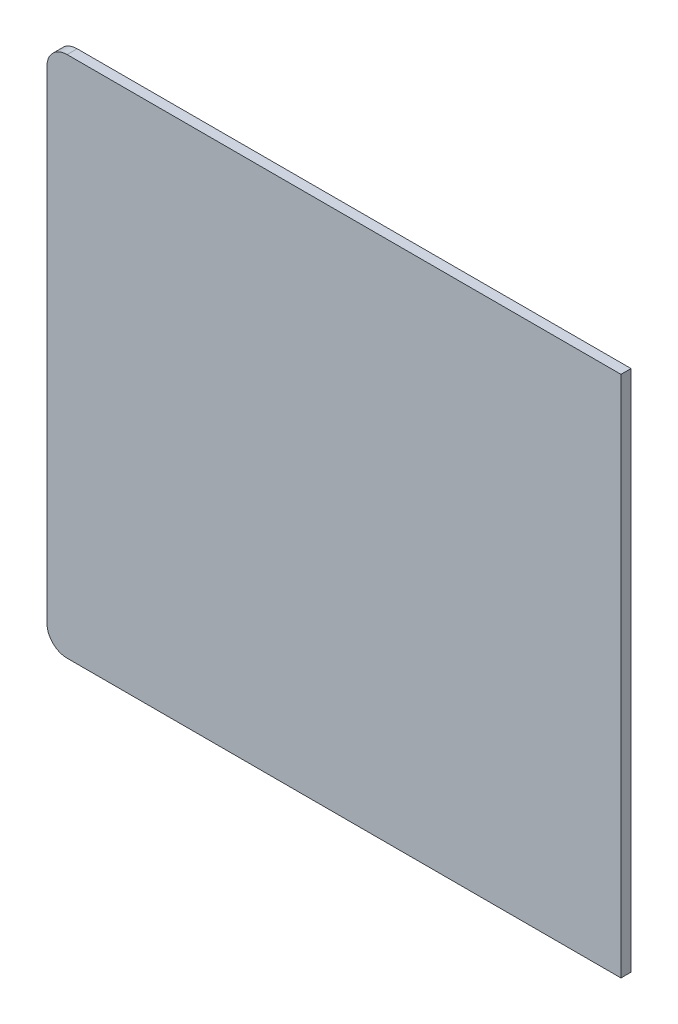
ISO-10303-21;
HEADER;
FILE_DESCRIPTION(('STEP AP214'),'2;1');
FILE_NAME('part.step','',(''),(''),'','','');
FILE_SCHEMA(('AUTOMOTIVE_DESIGN { 1 0 10303 214 1 1 1 1 }'));
ENDSEC;
DATA;
#1=APPLICATION_CONTEXT('core data for automotive mechanical design processes');
#2=APPLICATION_PROTOCOL_DEFINITION('international standard','automotive_design',2000,#1);
#3=PRODUCT_CONTEXT('',#1,'mechanical');
#4=PRODUCT('Part','Part','',(#3));
#5=PRODUCT_RELATED_PRODUCT_CATEGORY('part','',(#4));
#6=PRODUCT_DEFINITION_FORMATION('','',#4);
#7=PRODUCT_DEFINITION_CONTEXT('part definition',#1,'design');
#8=PRODUCT_DEFINITION('design','',#6,#7);
#9=PRODUCT_DEFINITION_SHAPE('','',#8);
#10=(LENGTH_UNIT() NAMED_UNIT(*) SI_UNIT(.MILLI.,.METRE.));
#11=(NAMED_UNIT(*) PLANE_ANGLE_UNIT() SI_UNIT($,.RADIAN.));
#12=(NAMED_UNIT(*) SI_UNIT($,.STERADIAN.) SOLID_ANGLE_UNIT());
#13=UNCERTAINTY_MEASURE_WITH_UNIT(LENGTH_MEASURE(1.E-05),#10,'distance_accuracy_value','');
#14=(GEOMETRIC_REPRESENTATION_CONTEXT(3) GLOBAL_UNCERTAINTY_ASSIGNED_CONTEXT((#13)) GLOBAL_UNIT_ASSIGNED_CONTEXT((#10,
#11,#12)) REPRESENTATION_CONTEXT('',''));
#15=CARTESIAN_POINT('',(0.,0.,0.));
#16=DIRECTION('',(0.,0.,1.));
#17=DIRECTION('',(1.,0.,0.));
#18=AXIS2_PLACEMENT_3D('',#15,#16,#17);
#19=CARTESIAN_POINT('',(-125.,130.,5.));
#20=DIRECTION('',(0.,-1.,0.));
#21=DIRECTION('',(0.,0.,-1.));
#22=AXIS2_PLACEMENT_3D('',#19,#20,#21);
#23=PLANE('',#22);
#24=DIRECTION('',(-1.,0.,0.));
#25=VECTOR('',#24,1.);
#26=CARTESIAN_POINT('',(-125.,130.,0.));
#27=LINE('',#26,#25);
#28=CARTESIAN_POINT('',(160.474180531189,130.,0.));
#29=VERTEX_POINT('',#28);
#30=CARTESIAN_POINT('',(-115.,130.,0.));
#31=VERTEX_POINT('',#30);
#32=EDGE_CURVE('E88',#29,#31,#27,.T.);
#33=ORIENTED_EDGE('',*,*,#32,.T.);
#34=DIRECTION('',(0.,0.,-1.));
#35=VECTOR('',#34,1.);
#36=CARTESIAN_POINT('',(-115.,130.,5.));
#37=LINE('',#36,#35);
#38=CARTESIAN_POINT('',(-115.,130.,5.));
#39=VERTEX_POINT('',#38);
#40=EDGE_CURVE('E11',#31,#39,#37,.F.);
#41=ORIENTED_EDGE('',*,*,#40,.T.);
#42=DIRECTION('',(-1.,0.,0.));
#43=VECTOR('',#42,1.);
#44=CARTESIAN_POINT('',(-125.,130.,5.));
#45=LINE('',#44,#43);
#46=CARTESIAN_POINT('',(160.474180531189,130.,5.));
#47=VERTEX_POINT('',#46);
#48=EDGE_CURVE('E101',#47,#39,#45,.T.);
#49=ORIENTED_EDGE('',*,*,#48,.F.);
#50=DIRECTION('',(0.,0.,-1.));
#51=VECTOR('',#50,1.);
#52=CARTESIAN_POINT('',(160.474180531189,130.,267.408874629574));
#53=LINE('',#52,#51);
#54=EDGE_CURVE('E100',#47,#29,#53,.T.);
#55=ORIENTED_EDGE('',*,*,#54,.T.);
#56=EDGE_LOOP('',(#33,#41,#49,#55));
#57=FACE_BOUND('',#56,.T.);
#58=ADVANCED_FACE('F35',(#57),#23,.F.);
#59=CARTESIAN_POINT('',(-125.,-130.,5.));
#60=DIRECTION('',(1.,0.,0.));
#61=DIRECTION('',(0.,0.,-1.));
#62=AXIS2_PLACEMENT_3D('',#59,#60,#61);
#63=PLANE('',#62);
#64=DIRECTION('',(0.,-1.,0.));
#65=VECTOR('',#64,1.);
#66=CARTESIAN_POINT('',(-125.,-130.,0.));
#67=LINE('',#66,#65);
#68=CARTESIAN_POINT('',(-125.,120.,0.));
#69=VERTEX_POINT('',#68);
#70=CARTESIAN_POINT('',(-125.,-120.,0.));
#71=VERTEX_POINT('',#70);
#72=EDGE_CURVE('E96',#69,#71,#67,.T.);
#73=ORIENTED_EDGE('',*,*,#72,.T.);
#74=DIRECTION('',(0.,0.,-1.));
#75=VECTOR('',#74,1.);
#76=CARTESIAN_POINT('',(-125.,-120.,5.));
#77=LINE('',#76,#75);
#78=CARTESIAN_POINT('',(-125.,-120.,5.));
#79=VERTEX_POINT('',#78);
#80=EDGE_CURVE('E56',#71,#79,#77,.F.);
#81=ORIENTED_EDGE('',*,*,#80,.T.);
#82=DIRECTION('',(0.,-1.,0.));
#83=VECTOR('',#82,1.);
#84=CARTESIAN_POINT('',(-125.,-130.,5.));
#85=LINE('',#84,#83);
#86=CARTESIAN_POINT('',(-125.,120.,5.));
#87=VERTEX_POINT('',#86);
#88=EDGE_CURVE('E115',#87,#79,#85,.T.);
#89=ORIENTED_EDGE('',*,*,#88,.F.);
#90=DIRECTION('',(0.,0.,-1.));
#91=VECTOR('',#90,1.);
#92=CARTESIAN_POINT('',(-125.,120.,5.));
#93=LINE('',#92,#91);
#94=EDGE_CURVE('E128',#87,#69,#93,.T.);
#95=ORIENTED_EDGE('',*,*,#94,.T.);
#96=EDGE_LOOP('',(#73,#81,#89,#95));
#97=FACE_BOUND('',#96,.T.);
#98=ADVANCED_FACE('F142',(#97),#63,.F.);
#99=CARTESIAN_POINT('',(-125.,-130.,5.));
#100=DIRECTION('',(0.,1.,0.));
#101=DIRECTION('',(0.,0.,1.));
#102=AXIS2_PLACEMENT_3D('',#99,#100,#101);
#103=PLANE('',#102);
#104=DIRECTION('',(1.,0.,0.));
#105=VECTOR('',#104,1.);
#106=CARTESIAN_POINT('',(-125.,-130.,5.));
#107=LINE('',#106,#105);
#108=CARTESIAN_POINT('',(-115.,-130.,5.));
#109=VERTEX_POINT('',#108);
#110=CARTESIAN_POINT('',(160.474180531189,-130.,5.));
#111=VERTEX_POINT('',#110);
#112=EDGE_CURVE('E118',#109,#111,#107,.T.);
#113=ORIENTED_EDGE('',*,*,#112,.F.);
#114=DIRECTION('',(0.,0.,-1.));
#115=VECTOR('',#114,1.);
#116=CARTESIAN_POINT('',(-115.,-130.,5.));
#117=LINE('',#116,#115);
#118=CARTESIAN_POINT('',(-115.,-130.,0.));
#119=VERTEX_POINT('',#118);
#120=EDGE_CURVE('E119',#109,#119,#117,.T.);
#121=ORIENTED_EDGE('',*,*,#120,.T.);
#122=DIRECTION('',(1.,0.,0.));
#123=VECTOR('',#122,1.);
#124=CARTESIAN_POINT('',(-125.,-130.,0.));
#125=LINE('',#124,#123);
#126=CARTESIAN_POINT('',(160.474180531189,-130.,0.));
#127=VERTEX_POINT('',#126);
#128=EDGE_CURVE('E116',#119,#127,#125,.T.);
#129=ORIENTED_EDGE('',*,*,#128,.T.);
#130=DIRECTION('',(0.,0.,-1.));
#131=VECTOR('',#130,1.);
#132=CARTESIAN_POINT('',(160.474180531189,-130.,267.408874629574));
#133=LINE('',#132,#131);
#134=EDGE_CURVE('E105',#111,#127,#133,.T.);
#135=ORIENTED_EDGE('',*,*,#134,.F.);
#136=EDGE_LOOP('',(#113,#121,#129,#135));
#137=FACE_BOUND('',#136,.T.);
#138=ADVANCED_FACE('F140',(#137),#103,.F.);
#139=CARTESIAN_POINT('',(0.,0.,5.));
#140=DIRECTION('',(0.,0.,-1.));
#141=DIRECTION('',(-1.,0.,0.));
#142=AXIS2_PLACEMENT_3D('',#139,#140,#141);
#143=PLANE('',#142);
#144=ORIENTED_EDGE('',*,*,#88,.T.);
#145=CARTESIAN_POINT('',(-115.,-120.,5.));
#146=DIRECTION('',(0.,0.,-1.));
#147=DIRECTION('',(-1.,0.,0.));
#148=AXIS2_PLACEMENT_3D('',#145,#146,#147);
#149=CIRCLE('',#148,10.);
#150=EDGE_CURVE('E43',#79,#109,#149,.F.);
#151=ORIENTED_EDGE('',*,*,#150,.T.);
#152=ORIENTED_EDGE('',*,*,#112,.T.);
#153=DIRECTION('',(0.,1.,0.));
#154=VECTOR('',#153,1.);
#155=CARTESIAN_POINT('',(160.474180531189,-130.,5.));
#156=LINE('',#155,#154);
#157=EDGE_CURVE('E97',#111,#47,#156,.T.);
#158=ORIENTED_EDGE('',*,*,#157,.T.);
#159=ORIENTED_EDGE('',*,*,#48,.T.);
#160=CARTESIAN_POINT('',(-115.,120.,5.));
#161=DIRECTION('',(0.,0.,-1.));
#162=DIRECTION('',(-1.,0.,0.));
#163=AXIS2_PLACEMENT_3D('',#160,#161,#162);
#164=CIRCLE('',#163,10.);
#165=EDGE_CURVE('E132',#39,#87,#164,.F.);
#166=ORIENTED_EDGE('',*,*,#165,.T.);
#167=EDGE_LOOP('',(#144,#151,#152,#158,#159,#166));
#168=FACE_BOUND('',#167,.T.);
#169=ADVANCED_FACE('F136',(#168),#143,.F.);
#170=CARTESIAN_POINT('',(0.,0.,0.));
#171=DIRECTION('',(0.,0.,-1.));
#172=DIRECTION('',(-1.,0.,0.));
#173=AXIS2_PLACEMENT_3D('',#170,#171,#172);
#174=PLANE('',#173);
#175=ORIENTED_EDGE('',*,*,#128,.F.);
#176=CARTESIAN_POINT('',(-115.,-120.,0.));
#177=DIRECTION('',(0.,0.,-1.));
#178=DIRECTION('',(-1.,0.,0.));
#179=AXIS2_PLACEMENT_3D('',#176,#177,#178);
#180=CIRCLE('',#179,10.);
#181=EDGE_CURVE('E126',#119,#71,#180,.T.);
#182=ORIENTED_EDGE('',*,*,#181,.T.);
#183=ORIENTED_EDGE('',*,*,#72,.F.);
#184=CARTESIAN_POINT('',(-115.,120.,0.));
#185=DIRECTION('',(0.,0.,-1.));
#186=DIRECTION('',(-1.,0.,0.));
#187=AXIS2_PLACEMENT_3D('',#184,#185,#186);
#188=CIRCLE('',#187,10.);
#189=EDGE_CURVE('E95',#69,#31,#188,.T.);
#190=ORIENTED_EDGE('',*,*,#189,.T.);
#191=ORIENTED_EDGE('',*,*,#32,.F.);
#192=DIRECTION('',(0.,-1.,0.));
#193=VECTOR('',#192,1.);
#194=CARTESIAN_POINT('',(160.474180531189,-130.,0.));
#195=LINE('',#194,#193);
#196=EDGE_CURVE('E93',#29,#127,#195,.T.);
#197=ORIENTED_EDGE('',*,*,#196,.T.);
#198=EDGE_LOOP('',(#175,#182,#183,#190,#191,#197));
#199=FACE_BOUND('',#198,.T.);
#200=ADVANCED_FACE('F91',(#199),#174,.T.);
#201=CARTESIAN_POINT('',(-115.,-120.,5.));
#202=DIRECTION('',(0.,0.,-1.));
#203=DIRECTION('',(-1.,0.,0.));
#204=AXIS2_PLACEMENT_3D('',#201,#202,#203);
#205=CYLINDRICAL_SURFACE('',#204,10.);
#206=ORIENTED_EDGE('',*,*,#150,.F.);
#207=ORIENTED_EDGE('',*,*,#80,.F.);
#208=ORIENTED_EDGE('',*,*,#181,.F.);
#209=ORIENTED_EDGE('',*,*,#120,.F.);
#210=EDGE_LOOP('',(#206,#207,#208,#209));
#211=FACE_BOUND('',#210,.T.);
#212=ADVANCED_FACE('F141',(#211),#205,.T.);
#213=CARTESIAN_POINT('',(-115.,120.,5.));
#214=DIRECTION('',(0.,0.,-1.));
#215=DIRECTION('',(-1.,0.,0.));
#216=AXIS2_PLACEMENT_3D('',#213,#214,#215);
#217=CYLINDRICAL_SURFACE('',#216,10.);
#218=ORIENTED_EDGE('',*,*,#165,.F.);
#219=ORIENTED_EDGE('',*,*,#40,.F.);
#220=ORIENTED_EDGE('',*,*,#189,.F.);
#221=ORIENTED_EDGE('',*,*,#94,.F.);
#222=EDGE_LOOP('',(#218,#219,#220,#221));
#223=FACE_BOUND('',#222,.T.);
#224=ADVANCED_FACE('F37',(#223),#217,.T.);
#225=CARTESIAN_POINT('',(160.474180531189,-130.,267.408874629574));
#226=DIRECTION('',(1.,0.,0.));
#227=DIRECTION('',(0.,0.,-1.));
#228=AXIS2_PLACEMENT_3D('',#225,#226,#227);
#229=PLANE('',#228);
#230=ORIENTED_EDGE('',*,*,#157,.F.);
#231=ORIENTED_EDGE('',*,*,#134,.T.);
#232=ORIENTED_EDGE('',*,*,#196,.F.);
#233=ORIENTED_EDGE('',*,*,#54,.F.);
#234=EDGE_LOOP('',(#230,#231,#232,#233));
#235=FACE_BOUND('',#234,.T.);
#236=ADVANCED_FACE('F108',(#235),#229,.T.);
#237=CLOSED_SHELL('',(#58,#98,#138,#169,#200,#212,#224,#236));
#238=MANIFOLD_SOLID_BREP('B2',#237);
#239=ADVANCED_BREP_SHAPE_REPRESENTATION('',(#18,#238),#14);
#240=SHAPE_DEFINITION_REPRESENTATION(#9,#239);
ENDSEC;
END-ISO-10303-21;
